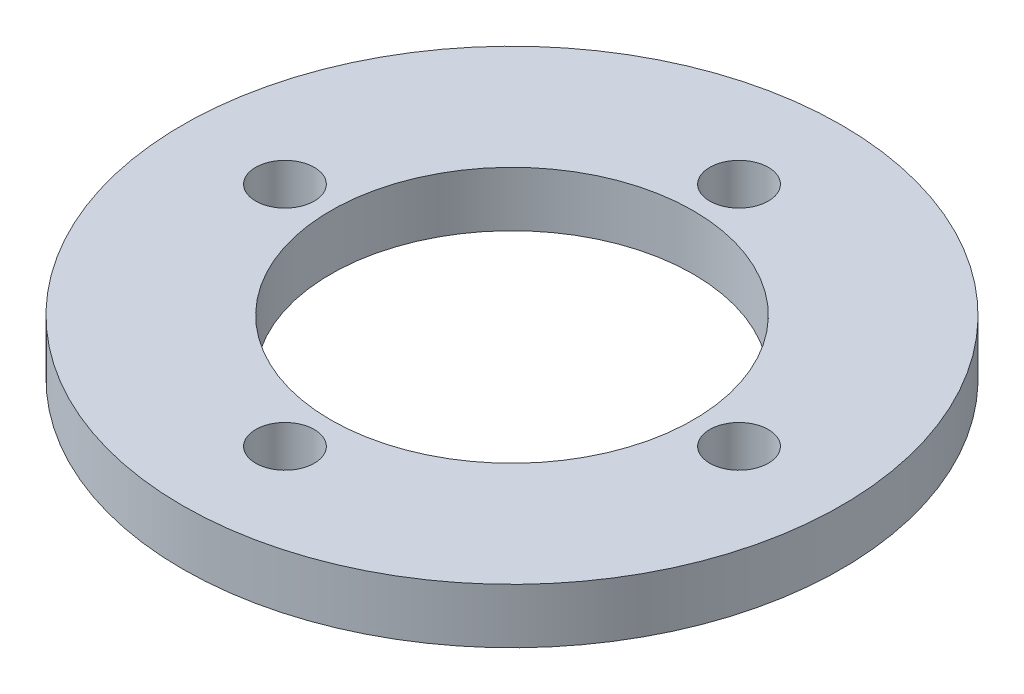
ISO-10303-21;
HEADER;
FILE_DESCRIPTION(('STEP AP214'),'2;1');
FILE_NAME('part.step','',(''),(''),'','','');
FILE_SCHEMA(('AUTOMOTIVE_DESIGN { 1 0 10303 214 1 1 1 1 }'));
ENDSEC;
DATA;
#1=APPLICATION_CONTEXT('core data for automotive mechanical design processes');
#2=APPLICATION_PROTOCOL_DEFINITION('international standard','automotive_design',2000,#1);
#3=PRODUCT_CONTEXT('',#1,'mechanical');
#4=PRODUCT('Part','Part','',(#3));
#5=PRODUCT_RELATED_PRODUCT_CATEGORY('part','',(#4));
#6=PRODUCT_DEFINITION_FORMATION('','',#4);
#7=PRODUCT_DEFINITION_CONTEXT('part definition',#1,'design');
#8=PRODUCT_DEFINITION('design','',#6,#7);
#9=PRODUCT_DEFINITION_SHAPE('','',#8);
#10=(LENGTH_UNIT() NAMED_UNIT(*) SI_UNIT(.MILLI.,.METRE.));
#11=(NAMED_UNIT(*) PLANE_ANGLE_UNIT() SI_UNIT($,.RADIAN.));
#12=(NAMED_UNIT(*) SI_UNIT($,.STERADIAN.) SOLID_ANGLE_UNIT());
#13=UNCERTAINTY_MEASURE_WITH_UNIT(LENGTH_MEASURE(1.E-05),#10,'distance_accuracy_value','');
#14=(GEOMETRIC_REPRESENTATION_CONTEXT(3) GLOBAL_UNCERTAINTY_ASSIGNED_CONTEXT((#13)) GLOBAL_UNIT_ASSIGNED_CONTEXT((#10,
#11,#12)) REPRESENTATION_CONTEXT('',''));
#15=CARTESIAN_POINT('',(0.,0.,0.));
#16=DIRECTION('',(0.,0.,1.));
#17=DIRECTION('',(1.,0.,0.));
#18=AXIS2_PLACEMENT_3D('',#15,#16,#17);
#19=CARTESIAN_POINT('',(0.,3.,0.));
#20=DIRECTION('',(0.,1.,0.));
#21=DIRECTION('',(0.,0.,1.));
#22=AXIS2_PLACEMENT_3D('',#19,#20,#21);
#23=PLANE('',#22);
#24=CARTESIAN_POINT('',(0.,3.,12.4));
#25=DIRECTION('',(0.,1.,0.));
#26=DIRECTION('',(0.,0.,1.));
#27=AXIS2_PLACEMENT_3D('',#24,#25,#26);
#28=CIRCLE('',#27,1.6);
#29=CARTESIAN_POINT('',(0.,3.,14.));
#30=VERTEX_POINT('',#29);
#31=EDGE_CURVE('E63',#30,#30,#28,.T.);
#32=ORIENTED_EDGE('',*,*,#31,.F.);
#33=EDGE_LOOP('',(#32));
#34=FACE_BOUND('',#33,.T.);
#35=CARTESIAN_POINT('',(0.,3.,-12.4));
#36=DIRECTION('',(0.,1.,0.));
#37=DIRECTION('',(0.,0.,1.));
#38=AXIS2_PLACEMENT_3D('',#35,#36,#37);
#39=CIRCLE('',#38,1.6);
#40=CARTESIAN_POINT('',(0.,3.,-10.8));
#41=VERTEX_POINT('',#40);
#42=EDGE_CURVE('E51',#41,#41,#39,.T.);
#43=ORIENTED_EDGE('',*,*,#42,.F.);
#44=EDGE_LOOP('',(#43));
#45=FACE_BOUND('',#44,.T.);
#46=CARTESIAN_POINT('',(0.,3.,0.));
#47=DIRECTION('',(0.,1.,0.));
#48=DIRECTION('',(0.,0.,1.));
#49=AXIS2_PLACEMENT_3D('',#46,#47,#48);
#50=CIRCLE('',#49,18.);
#51=CARTESIAN_POINT('',(0.,3.,18.));
#52=VERTEX_POINT('',#51);
#53=EDGE_CURVE('E10',#52,#52,#50,.T.);
#54=ORIENTED_EDGE('',*,*,#53,.T.);
#55=EDGE_LOOP('',(#54));
#56=FACE_BOUND('',#55,.T.);
#57=CARTESIAN_POINT('',(0.,3.,0.));
#58=DIRECTION('',(0.,1.,0.));
#59=DIRECTION('',(0.,0.,1.));
#60=AXIS2_PLACEMENT_3D('',#57,#58,#59);
#61=CIRCLE('',#60,9.9);
#62=CARTESIAN_POINT('',(0.,3.,9.9));
#63=VERTEX_POINT('',#62);
#64=EDGE_CURVE('E46',#63,#63,#61,.T.);
#65=ORIENTED_EDGE('',*,*,#64,.F.);
#66=EDGE_LOOP('',(#65));
#67=FACE_BOUND('',#66,.T.);
#68=CARTESIAN_POINT('',(12.4,3.,0.));
#69=DIRECTION('',(0.,1.,0.));
#70=DIRECTION('',(0.,0.,1.));
#71=AXIS2_PLACEMENT_3D('',#68,#69,#70);
#72=CIRCLE('',#71,1.6);
#73=CARTESIAN_POINT('',(12.4,3.,1.60000000000004));
#74=VERTEX_POINT('',#73);
#75=EDGE_CURVE('E57',#74,#74,#72,.T.);
#76=ORIENTED_EDGE('',*,*,#75,.F.);
#77=EDGE_LOOP('',(#76));
#78=FACE_BOUND('',#77,.T.);
#79=CARTESIAN_POINT('',(-12.4,3.,0.));
#80=DIRECTION('',(0.,1.,0.));
#81=DIRECTION('',(0.,0.,1.));
#82=AXIS2_PLACEMENT_3D('',#79,#80,#81);
#83=CIRCLE('',#82,1.6);
#84=CARTESIAN_POINT('',(-12.4,3.,1.6));
#85=VERTEX_POINT('',#84);
#86=EDGE_CURVE('E69',#85,#85,#83,.T.);
#87=ORIENTED_EDGE('',*,*,#86,.F.);
#88=EDGE_LOOP('',(#87));
#89=FACE_BOUND('',#88,.T.);
#90=ADVANCED_FACE('F35',(#34,#45,#56,#67,#78,#89),#23,.T.);
#91=CARTESIAN_POINT('',(0.,0.,0.));
#92=DIRECTION('',(0.,1.,0.));
#93=DIRECTION('',(0.,0.,1.));
#94=AXIS2_PLACEMENT_3D('',#91,#92,#93);
#95=PLANE('',#94);
#96=CARTESIAN_POINT('',(0.,0.,0.));
#97=DIRECTION('',(0.,1.,0.));
#98=DIRECTION('',(0.,0.,1.));
#99=AXIS2_PLACEMENT_3D('',#96,#97,#98);
#100=CIRCLE('',#99,18.);
#101=CARTESIAN_POINT('',(0.,0.,18.));
#102=VERTEX_POINT('',#101);
#103=EDGE_CURVE('E39',#102,#102,#100,.T.);
#104=ORIENTED_EDGE('',*,*,#103,.F.);
#105=EDGE_LOOP('',(#104));
#106=FACE_BOUND('',#105,.T.);
#107=CARTESIAN_POINT('',(0.,0.,0.));
#108=DIRECTION('',(0.,1.,0.));
#109=DIRECTION('',(0.,0.,1.));
#110=AXIS2_PLACEMENT_3D('',#107,#108,#109);
#111=CIRCLE('',#110,9.9);
#112=CARTESIAN_POINT('',(0.,0.,9.9));
#113=VERTEX_POINT('',#112);
#114=EDGE_CURVE('E48',#113,#113,#111,.T.);
#115=ORIENTED_EDGE('',*,*,#114,.T.);
#116=EDGE_LOOP('',(#115));
#117=FACE_BOUND('',#116,.T.);
#118=CARTESIAN_POINT('',(0.,0.,-12.4));
#119=DIRECTION('',(0.,1.,0.));
#120=DIRECTION('',(0.,0.,1.));
#121=AXIS2_PLACEMENT_3D('',#118,#119,#120);
#122=CIRCLE('',#121,1.6);
#123=CARTESIAN_POINT('',(0.,0.,-10.8));
#124=VERTEX_POINT('',#123);
#125=EDGE_CURVE('E54',#124,#124,#122,.T.);
#126=ORIENTED_EDGE('',*,*,#125,.T.);
#127=EDGE_LOOP('',(#126));
#128=FACE_BOUND('',#127,.T.);
#129=CARTESIAN_POINT('',(12.4,0.,0.));
#130=DIRECTION('',(0.,1.,0.));
#131=DIRECTION('',(0.,0.,1.));
#132=AXIS2_PLACEMENT_3D('',#129,#130,#131);
#133=CIRCLE('',#132,1.6);
#134=CARTESIAN_POINT('',(12.4,0.,1.60000000000004));
#135=VERTEX_POINT('',#134);
#136=EDGE_CURVE('E60',#135,#135,#133,.T.);
#137=ORIENTED_EDGE('',*,*,#136,.T.);
#138=EDGE_LOOP('',(#137));
#139=FACE_BOUND('',#138,.T.);
#140=CARTESIAN_POINT('',(0.,0.,12.4));
#141=DIRECTION('',(0.,1.,0.));
#142=DIRECTION('',(0.,0.,1.));
#143=AXIS2_PLACEMENT_3D('',#140,#141,#142);
#144=CIRCLE('',#143,1.6);
#145=CARTESIAN_POINT('',(0.,0.,14.));
#146=VERTEX_POINT('',#145);
#147=EDGE_CURVE('E66',#146,#146,#144,.T.);
#148=ORIENTED_EDGE('',*,*,#147,.T.);
#149=EDGE_LOOP('',(#148));
#150=FACE_BOUND('',#149,.T.);
#151=CARTESIAN_POINT('',(-12.4,0.,0.));
#152=DIRECTION('',(0.,1.,0.));
#153=DIRECTION('',(0.,0.,1.));
#154=AXIS2_PLACEMENT_3D('',#151,#152,#153);
#155=CIRCLE('',#154,1.6);
#156=CARTESIAN_POINT('',(-12.4,0.,1.6));
#157=VERTEX_POINT('',#156);
#158=EDGE_CURVE('E72',#157,#157,#155,.T.);
#159=ORIENTED_EDGE('',*,*,#158,.T.);
#160=EDGE_LOOP('',(#159));
#161=FACE_BOUND('',#160,.T.);
#162=ADVANCED_FACE('F82',(#106,#117,#128,#139,#150,#161),#95,.F.);
#163=CARTESIAN_POINT('',(0.,3.,0.));
#164=DIRECTION('',(0.,-1.,0.));
#165=DIRECTION('',(0.,0.,-1.));
#166=AXIS2_PLACEMENT_3D('',#163,#164,#165);
#167=CYLINDRICAL_SURFACE('',#166,18.);
#168=ORIENTED_EDGE('',*,*,#53,.F.);
#169=EDGE_LOOP('',(#168));
#170=FACE_BOUND('',#169,.T.);
#171=ORIENTED_EDGE('',*,*,#103,.T.);
#172=EDGE_LOOP('',(#171));
#173=FACE_BOUND('',#172,.T.);
#174=ADVANCED_FACE('F37',(#170,#173),#167,.T.);
#175=CARTESIAN_POINT('',(0.,3.,0.));
#176=DIRECTION('',(0.,-1.,0.));
#177=DIRECTION('',(0.,0.,-1.));
#178=AXIS2_PLACEMENT_3D('',#175,#176,#177);
#179=CYLINDRICAL_SURFACE('',#178,9.9);
#180=ORIENTED_EDGE('',*,*,#64,.T.);
#181=EDGE_LOOP('',(#180));
#182=FACE_BOUND('',#181,.T.);
#183=ORIENTED_EDGE('',*,*,#114,.F.);
#184=EDGE_LOOP('',(#183));
#185=FACE_BOUND('',#184,.T.);
#186=ADVANCED_FACE('F92',(#182,#185),#179,.F.);
#187=CARTESIAN_POINT('',(0.,3.,-12.4));
#188=DIRECTION('',(0.,-1.,0.));
#189=DIRECTION('',(0.,0.,-1.));
#190=AXIS2_PLACEMENT_3D('',#187,#188,#189);
#191=CYLINDRICAL_SURFACE('',#190,1.6);
#192=ORIENTED_EDGE('',*,*,#42,.T.);
#193=EDGE_LOOP('',(#192));
#194=FACE_BOUND('',#193,.T.);
#195=ORIENTED_EDGE('',*,*,#125,.F.);
#196=EDGE_LOOP('',(#195));
#197=FACE_BOUND('',#196,.T.);
#198=ADVANCED_FACE('F95',(#194,#197),#191,.F.);
#199=CARTESIAN_POINT('',(12.4,3.,0.));
#200=DIRECTION('',(0.,-1.,0.));
#201=DIRECTION('',(0.,0.,-1.));
#202=AXIS2_PLACEMENT_3D('',#199,#200,#201);
#203=CYLINDRICAL_SURFACE('',#202,1.6);
#204=ORIENTED_EDGE('',*,*,#75,.T.);
#205=EDGE_LOOP('',(#204));
#206=FACE_BOUND('',#205,.T.);
#207=ORIENTED_EDGE('',*,*,#136,.F.);
#208=EDGE_LOOP('',(#207));
#209=FACE_BOUND('',#208,.T.);
#210=ADVANCED_FACE('F99',(#206,#209),#203,.F.);
#211=CARTESIAN_POINT('',(0.,3.,12.4));
#212=DIRECTION('',(0.,-1.,0.));
#213=DIRECTION('',(0.,0.,-1.));
#214=AXIS2_PLACEMENT_3D('',#211,#212,#213);
#215=CYLINDRICAL_SURFACE('',#214,1.6);
#216=ORIENTED_EDGE('',*,*,#31,.T.);
#217=EDGE_LOOP('',(#216));
#218=FACE_BOUND('',#217,.T.);
#219=ORIENTED_EDGE('',*,*,#147,.F.);
#220=EDGE_LOOP('',(#219));
#221=FACE_BOUND('',#220,.T.);
#222=ADVANCED_FACE('F103',(#218,#221),#215,.F.);
#223=CARTESIAN_POINT('',(-12.4,3.,0.));
#224=DIRECTION('',(0.,-1.,0.));
#225=DIRECTION('',(0.,0.,-1.));
#226=AXIS2_PLACEMENT_3D('',#223,#224,#225);
#227=CYLINDRICAL_SURFACE('',#226,1.6);
#228=ORIENTED_EDGE('',*,*,#86,.T.);
#229=EDGE_LOOP('',(#228));
#230=FACE_BOUND('',#229,.T.);
#231=ORIENTED_EDGE('',*,*,#158,.F.);
#232=EDGE_LOOP('',(#231));
#233=FACE_BOUND('',#232,.T.);
#234=ADVANCED_FACE('F78',(#230,#233),#227,.F.);
#235=CLOSED_SHELL('',(#90,#162,#174,#186,#198,#210,#222,#234));
#236=MANIFOLD_SOLID_BREP('B2',#235);
#237=ADVANCED_BREP_SHAPE_REPRESENTATION('',(#18,#236),#14);
#238=SHAPE_DEFINITION_REPRESENTATION(#9,#237);
ENDSEC;
END-ISO-10303-21;
